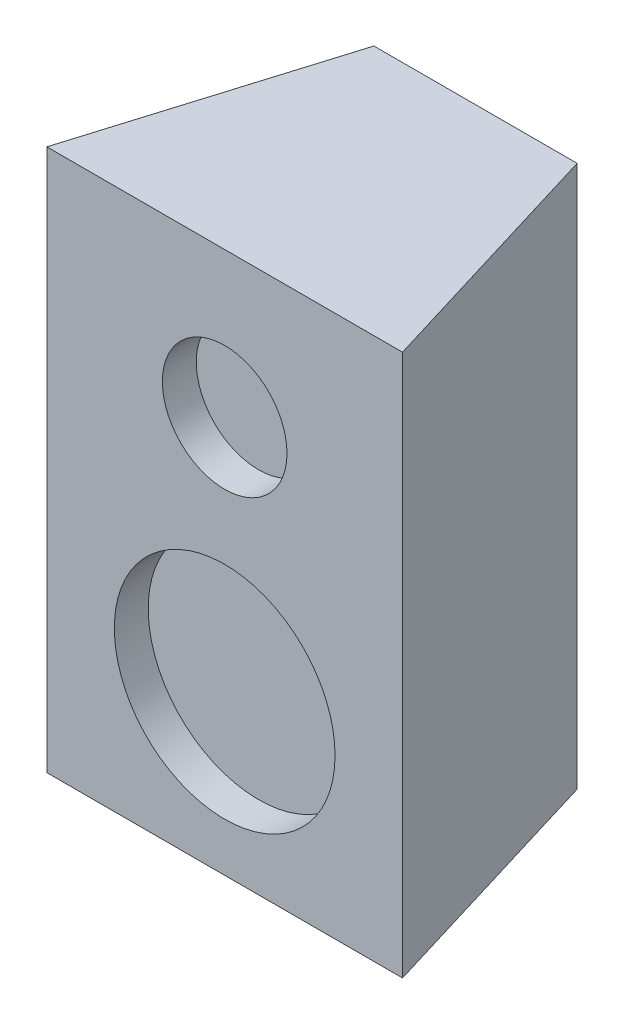
ISO-10303-21;
HEADER;
FILE_DESCRIPTION(('STEP AP214'),'2;1');
FILE_NAME('part.step','',(''),(''),'','','');
FILE_SCHEMA(('AUTOMOTIVE_DESIGN { 1 0 10303 214 1 1 1 1 }'));
ENDSEC;
DATA;
#1=APPLICATION_CONTEXT('core data for automotive mechanical design processes');
#2=APPLICATION_PROTOCOL_DEFINITION('international standard','automotive_design',2000,#1);
#3=PRODUCT_CONTEXT('',#1,'mechanical');
#4=PRODUCT('Part','Part','',(#3));
#5=PRODUCT_RELATED_PRODUCT_CATEGORY('part','',(#4));
#6=PRODUCT_DEFINITION_FORMATION('','',#4);
#7=PRODUCT_DEFINITION_CONTEXT('part definition',#1,'design');
#8=PRODUCT_DEFINITION('design','',#6,#7);
#9=PRODUCT_DEFINITION_SHAPE('','',#8);
#10=(LENGTH_UNIT() NAMED_UNIT(*) SI_UNIT(.MILLI.,.METRE.));
#11=(NAMED_UNIT(*) PLANE_ANGLE_UNIT() SI_UNIT($,.RADIAN.));
#12=(NAMED_UNIT(*) SI_UNIT($,.STERADIAN.) SOLID_ANGLE_UNIT());
#13=UNCERTAINTY_MEASURE_WITH_UNIT(LENGTH_MEASURE(1.E-05),#10,'distance_accuracy_value','');
#14=(GEOMETRIC_REPRESENTATION_CONTEXT(3) GLOBAL_UNCERTAINTY_ASSIGNED_CONTEXT((#13)) GLOBAL_UNIT_ASSIGNED_CONTEXT((#10,
#11,#12)) REPRESENTATION_CONTEXT('',''));
#15=CARTESIAN_POINT('',(0.,0.,0.));
#16=DIRECTION('',(0.,0.,1.));
#17=DIRECTION('',(1.,0.,0.));
#18=AXIS2_PLACEMENT_3D('',#15,#16,#17);
#19=CARTESIAN_POINT('',(-47.9365654205607,203.2,-94.0533878567919));
#20=DIRECTION('',(0.956815293388979,0.,0.290696567466769));
#21=DIRECTION('',(0.290696567466769,0.,-0.956815293388979));
#22=AXIS2_PLACEMENT_3D('',#19,#20,#21);
#23=PLANE('',#22);
#24=DIRECTION('',(-0.290696567466769,0.,0.956815293388979));
#25=VECTOR('',#24,1.);
#26=CARTESIAN_POINT('',(-47.9365654205607,0.,-94.0533878567919));
#27=LINE('',#26,#25);
#28=CARTESIAN_POINT('',(-47.9365654205607,0.,-94.0533878567919));
#29=VERTEX_POINT('',#28);
#30=CARTESIAN_POINT('',(-76.5115654205608,0.,0.));
#31=VERTEX_POINT('',#30);
#32=EDGE_CURVE('E102',#29,#31,#27,.T.);
#33=ORIENTED_EDGE('',*,*,#32,.T.);
#34=DIRECTION('',(0.,-1.,0.));
#35=VECTOR('',#34,1.);
#36=CARTESIAN_POINT('',(-76.5115654205608,203.2,0.));
#37=LINE('',#36,#35);
#38=CARTESIAN_POINT('',(-76.5115654205608,203.2,0.));
#39=VERTEX_POINT('',#38);
#40=EDGE_CURVE('E11',#39,#31,#37,.T.);
#41=ORIENTED_EDGE('',*,*,#40,.F.);
#42=DIRECTION('',(-0.290696567466769,0.,0.956815293388979));
#43=VECTOR('',#42,1.);
#44=CARTESIAN_POINT('',(-47.9365654205607,203.2,-94.0533878567919));
#45=LINE('',#44,#43);
#46=CARTESIAN_POINT('',(-47.9365654205607,203.2,-94.0533878567919));
#47=VERTEX_POINT('',#46);
#48=EDGE_CURVE('E90',#47,#39,#45,.T.);
#49=ORIENTED_EDGE('',*,*,#48,.F.);
#50=DIRECTION('',(0.,-1.,0.));
#51=VECTOR('',#50,1.);
#52=CARTESIAN_POINT('',(-47.9365654205607,203.2,-94.0533878567919));
#53=LINE('',#52,#51);
#54=EDGE_CURVE('E98',#47,#29,#53,.T.);
#55=ORIENTED_EDGE('',*,*,#54,.T.);
#56=EDGE_LOOP('',(#33,#41,#49,#55));
#57=FACE_BOUND('',#56,.T.);
#58=ADVANCED_FACE('F39',(#57),#23,.F.);
#59=CARTESIAN_POINT('',(-76.5115654205608,203.2,0.));
#60=DIRECTION('',(0.,0.,-1.));
#61=DIRECTION('',(-1.,0.,0.));
#62=AXIS2_PLACEMENT_3D('',#59,#60,#61);
#63=PLANE('',#62);
#64=CARTESIAN_POINT('',(-9.83656542056076,148.691225426467,0.));
#65=DIRECTION('',(0.,0.,1.));
#66=DIRECTION('',(1.,0.,0.));
#67=AXIS2_PLACEMENT_3D('',#64,#65,#66);
#68=CIRCLE('',#67,23.365349898744);
#69=CARTESIAN_POINT('',(13.5287844781832,148.691225426467,0.));
#70=VERTEX_POINT('',#69);
#71=EDGE_CURVE('E122',#70,#70,#68,.T.);
#72=ORIENTED_EDGE('',*,*,#71,.F.);
#73=EDGE_LOOP('',(#72));
#74=FACE_BOUND('',#73,.T.);
#75=CARTESIAN_POINT('',(-9.83656542056076,59.6018259688873,0.));
#76=DIRECTION('',(0.,0.,1.));
#77=DIRECTION('',(1.,0.,0.));
#78=AXIS2_PLACEMENT_3D('',#75,#76,#77);
#79=CIRCLE('',#78,41.3785319471185);
#80=CARTESIAN_POINT('',(31.5419665265577,59.6018259688873,0.));
#81=VERTEX_POINT('',#80);
#82=EDGE_CURVE('E119',#81,#81,#79,.T.);
#83=ORIENTED_EDGE('',*,*,#82,.F.);
#84=EDGE_LOOP('',(#83));
#85=FACE_BOUND('',#84,.T.);
#86=DIRECTION('',(1.,0.,0.));
#87=VECTOR('',#86,1.);
#88=CARTESIAN_POINT('',(-76.5115654205608,0.,0.));
#89=LINE('',#88,#87);
#90=CARTESIAN_POINT('',(56.8384345794392,0.,0.));
#91=VERTEX_POINT('',#90);
#92=EDGE_CURVE('E94',#31,#91,#89,.T.);
#93=ORIENTED_EDGE('',*,*,#92,.T.);
#94=DIRECTION('',(0.,-1.,0.));
#95=VECTOR('',#94,1.);
#96=CARTESIAN_POINT('',(56.8384345794392,203.2,0.));
#97=LINE('',#96,#95);
#98=CARTESIAN_POINT('',(56.8384345794392,203.2,0.));
#99=VERTEX_POINT('',#98);
#100=EDGE_CURVE('E47',#99,#91,#97,.T.);
#101=ORIENTED_EDGE('',*,*,#100,.F.);
#102=DIRECTION('',(1.,0.,0.));
#103=VECTOR('',#102,1.);
#104=CARTESIAN_POINT('',(-76.5115654205608,203.2,0.));
#105=LINE('',#104,#103);
#106=EDGE_CURVE('E85',#39,#99,#105,.T.);
#107=ORIENTED_EDGE('',*,*,#106,.F.);
#108=ORIENTED_EDGE('',*,*,#40,.T.);
#109=EDGE_LOOP('',(#93,#101,#107,#108));
#110=FACE_BOUND('',#109,.T.);
#111=ADVANCED_FACE('F93',(#74,#85,#110),#63,.F.);
#112=CARTESIAN_POINT('',(56.8384345794392,203.2,0.));
#113=DIRECTION('',(-0.956815293388979,0.,0.290696567466769));
#114=DIRECTION('',(0.290696567466769,0.,0.956815293388979));
#115=AXIS2_PLACEMENT_3D('',#112,#113,#114);
#116=PLANE('',#115);
#117=DIRECTION('',(-0.290696567466769,0.,-0.956815293388979));
#118=VECTOR('',#117,1.);
#119=CARTESIAN_POINT('',(56.8384345794392,0.,0.));
#120=LINE('',#119,#118);
#121=CARTESIAN_POINT('',(28.2634345794393,0.,-94.0533878567919));
#122=VERTEX_POINT('',#121);
#123=EDGE_CURVE('E72',#91,#122,#120,.T.);
#124=ORIENTED_EDGE('',*,*,#123,.T.);
#125=DIRECTION('',(0.,-1.,0.));
#126=VECTOR('',#125,1.);
#127=CARTESIAN_POINT('',(28.2634345794393,203.2,-94.0533878567919));
#128=LINE('',#127,#126);
#129=CARTESIAN_POINT('',(28.2634345794393,203.2,-94.0533878567919));
#130=VERTEX_POINT('',#129);
#131=EDGE_CURVE('E95',#130,#122,#128,.T.);
#132=ORIENTED_EDGE('',*,*,#131,.F.);
#133=DIRECTION('',(-0.290696567466769,0.,-0.956815293388979));
#134=VECTOR('',#133,1.);
#135=CARTESIAN_POINT('',(56.8384345794392,203.2,0.));
#136=LINE('',#135,#134);
#137=EDGE_CURVE('E88',#99,#130,#136,.T.);
#138=ORIENTED_EDGE('',*,*,#137,.F.);
#139=ORIENTED_EDGE('',*,*,#100,.T.);
#140=EDGE_LOOP('',(#124,#132,#138,#139));
#141=FACE_BOUND('',#140,.T.);
#142=ADVANCED_FACE('F96',(#141),#116,.F.);
#143=CARTESIAN_POINT('',(28.2634345794393,203.2,-94.0533878567919));
#144=DIRECTION('',(0.,0.,1.));
#145=DIRECTION('',(1.,0.,0.));
#146=AXIS2_PLACEMENT_3D('',#143,#144,#145);
#147=PLANE('',#146);
#148=DIRECTION('',(-1.,0.,0.));
#149=VECTOR('',#148,1.);
#150=CARTESIAN_POINT('',(28.2634345794393,0.,-94.0533878567919));
#151=LINE('',#150,#149);
#152=EDGE_CURVE('E78',#122,#29,#151,.T.);
#153=ORIENTED_EDGE('',*,*,#152,.T.);
#154=ORIENTED_EDGE('',*,*,#54,.F.);
#155=DIRECTION('',(-1.,0.,0.));
#156=VECTOR('',#155,1.);
#157=CARTESIAN_POINT('',(28.2634345794393,203.2,-94.0533878567919));
#158=LINE('',#157,#156);
#159=EDGE_CURVE('E55',#130,#47,#158,.T.);
#160=ORIENTED_EDGE('',*,*,#159,.F.);
#161=ORIENTED_EDGE('',*,*,#131,.T.);
#162=EDGE_LOOP('',(#153,#154,#160,#161));
#163=FACE_BOUND('',#162,.T.);
#164=ADVANCED_FACE('F110',(#163),#147,.F.);
#165=CARTESIAN_POINT('',(0.,203.2,0.));
#166=DIRECTION('',(0.,1.,0.));
#167=DIRECTION('',(0.,0.,1.));
#168=AXIS2_PLACEMENT_3D('',#165,#166,#167);
#169=PLANE('',#168);
#170=ORIENTED_EDGE('',*,*,#48,.T.);
#171=ORIENTED_EDGE('',*,*,#106,.T.);
#172=ORIENTED_EDGE('',*,*,#137,.T.);
#173=ORIENTED_EDGE('',*,*,#159,.T.);
#174=EDGE_LOOP('',(#170,#171,#172,#173));
#175=FACE_BOUND('',#174,.T.);
#176=ADVANCED_FACE('F86',(#175),#169,.T.);
#177=CARTESIAN_POINT('',(0.,0.,0.));
#178=DIRECTION('',(0.,1.,0.));
#179=DIRECTION('',(0.,0.,1.));
#180=AXIS2_PLACEMENT_3D('',#177,#178,#179);
#181=PLANE('',#180);
#182=ORIENTED_EDGE('',*,*,#32,.F.);
#183=ORIENTED_EDGE('',*,*,#152,.F.);
#184=ORIENTED_EDGE('',*,*,#123,.F.);
#185=ORIENTED_EDGE('',*,*,#92,.F.);
#186=EDGE_LOOP('',(#182,#183,#184,#185));
#187=FACE_BOUND('',#186,.T.);
#188=ADVANCED_FACE('F113',(#187),#181,.F.);
#189=CARTESIAN_POINT('',(-9.83656542056076,59.6018259688873,-12.7));
#190=DIRECTION('',(0.,0.,1.));
#191=DIRECTION('',(1.,0.,0.));
#192=AXIS2_PLACEMENT_3D('',#189,#190,#191);
#193=CYLINDRICAL_SURFACE('',#192,41.3785319471185);
#194=CARTESIAN_POINT('',(-9.83656542056076,59.6018259688873,-12.7));
#195=DIRECTION('',(0.,0.,1.));
#196=DIRECTION('',(1.,0.,0.));
#197=AXIS2_PLACEMENT_3D('',#194,#195,#196);
#198=CIRCLE('',#197,41.3785319471185);
#199=CARTESIAN_POINT('',(31.5419665265577,59.6018259688873,-12.7));
#200=VERTEX_POINT('',#199);
#201=EDGE_CURVE('E116',#200,#200,#198,.T.);
#202=ORIENTED_EDGE('',*,*,#201,.F.);
#203=EDGE_LOOP('',(#202));
#204=FACE_BOUND('',#203,.T.);
#205=ORIENTED_EDGE('',*,*,#82,.T.);
#206=EDGE_LOOP('',(#205));
#207=FACE_BOUND('',#206,.T.);
#208=ADVANCED_FACE('F141',(#204,#207),#193,.F.);
#209=CARTESIAN_POINT('',(-9.83656542056076,59.6018259688873,-12.7));
#210=DIRECTION('',(0.,0.,1.));
#211=DIRECTION('',(1.,0.,0.));
#212=AXIS2_PLACEMENT_3D('',#209,#210,#211);
#213=PLANE('',#212);
#214=ORIENTED_EDGE('',*,*,#201,.T.);
#215=EDGE_LOOP('',(#214));
#216=FACE_BOUND('',#215,.T.);
#217=ADVANCED_FACE('F133',(#216),#213,.T.);
#218=CARTESIAN_POINT('',(-9.83656542056076,148.691225426467,-12.7));
#219=DIRECTION('',(0.,0.,1.));
#220=DIRECTION('',(1.,0.,0.));
#221=AXIS2_PLACEMENT_3D('',#218,#219,#220);
#222=CYLINDRICAL_SURFACE('',#221,23.365349898744);
#223=CARTESIAN_POINT('',(-9.83656542056076,148.691225426467,-12.7));
#224=DIRECTION('',(0.,0.,1.));
#225=DIRECTION('',(1.,0.,0.));
#226=AXIS2_PLACEMENT_3D('',#223,#224,#225);
#227=CIRCLE('',#226,23.365349898744);
#228=CARTESIAN_POINT('',(13.5287844781832,148.691225426467,-12.7));
#229=VERTEX_POINT('',#228);
#230=EDGE_CURVE('E105',#229,#229,#227,.T.);
#231=ORIENTED_EDGE('',*,*,#230,.F.);
#232=EDGE_LOOP('',(#231));
#233=FACE_BOUND('',#232,.T.);
#234=ORIENTED_EDGE('',*,*,#71,.T.);
#235=EDGE_LOOP('',(#234));
#236=FACE_BOUND('',#235,.T.);
#237=ADVANCED_FACE('F130',(#233,#236),#222,.F.);
#238=CARTESIAN_POINT('',(-9.83656542056076,148.691225426467,-12.7));
#239=DIRECTION('',(0.,0.,1.));
#240=DIRECTION('',(1.,0.,0.));
#241=AXIS2_PLACEMENT_3D('',#238,#239,#240);
#242=PLANE('',#241);
#243=ORIENTED_EDGE('',*,*,#230,.T.);
#244=EDGE_LOOP('',(#243));
#245=FACE_BOUND('',#244,.T.);
#246=ADVANCED_FACE('F128',(#245),#242,.T.);
#247=CLOSED_SHELL('',(#58,#111,#142,#164,#176,#188,#208,#217,#237,#246));
#248=MANIFOLD_SOLID_BREP('B2',#247);
#249=ADVANCED_BREP_SHAPE_REPRESENTATION('',(#18,#248),#14);
#250=SHAPE_DEFINITION_REPRESENTATION(#9,#249);
ENDSEC;
END-ISO-10303-21;
